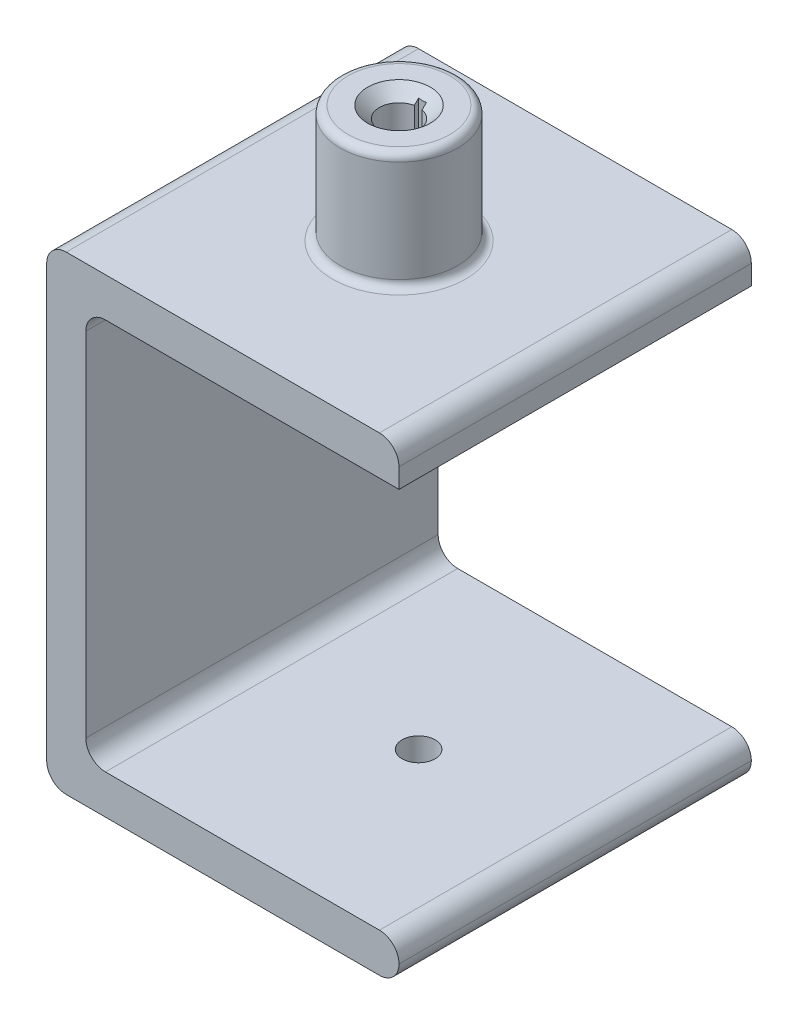
ISO-10303-21;
HEADER;
FILE_DESCRIPTION(('STEP AP214'),'2;1');
FILE_NAME('part.step','',(''),(''),'','','');
FILE_SCHEMA(('AUTOMOTIVE_DESIGN { 1 0 10303 214 1 1 1 1 }'));
ENDSEC;
DATA;
#1=APPLICATION_CONTEXT('core data for automotive mechanical design processes');
#2=APPLICATION_PROTOCOL_DEFINITION('international standard','automotive_design',2000,#1);
#3=PRODUCT_CONTEXT('',#1,'mechanical');
#4=PRODUCT('Part','Part','',(#3));
#5=PRODUCT_RELATED_PRODUCT_CATEGORY('part','',(#4));
#6=PRODUCT_DEFINITION_FORMATION('','',#4);
#7=PRODUCT_DEFINITION_CONTEXT('part definition',#1,'design');
#8=PRODUCT_DEFINITION('design','',#6,#7);
#9=PRODUCT_DEFINITION_SHAPE('','',#8);
#10=(LENGTH_UNIT() NAMED_UNIT(*) SI_UNIT(.MILLI.,.METRE.));
#11=(NAMED_UNIT(*) PLANE_ANGLE_UNIT() SI_UNIT($,.RADIAN.));
#12=(NAMED_UNIT(*) SI_UNIT($,.STERADIAN.) SOLID_ANGLE_UNIT());
#13=UNCERTAINTY_MEASURE_WITH_UNIT(LENGTH_MEASURE(1.E-05),#10,'distance_accuracy_value','');
#14=(GEOMETRIC_REPRESENTATION_CONTEXT(3) GLOBAL_UNCERTAINTY_ASSIGNED_CONTEXT((#13)) GLOBAL_UNIT_ASSIGNED_CONTEXT((#10,
#11,#12)) REPRESENTATION_CONTEXT('',''));
#15=CARTESIAN_POINT('',(0.,0.,0.));
#16=DIRECTION('',(0.,0.,1.));
#17=DIRECTION('',(1.,0.,0.));
#18=AXIS2_PLACEMENT_3D('',#15,#16,#17);
#19=CARTESIAN_POINT('',(0.,152.4,57.15));
#20=DIRECTION('',(0.,-1.,0.));
#21=DIRECTION('',(1.,0.,0.));
#22=AXIS2_PLACEMENT_3D('',#19,#20,#21);
#23=PLANE('',#22);
#24=CARTESIAN_POINT('',(57.15,152.4,0.));
#25=DIRECTION('',(0.,-1.,0.));
#26=DIRECTION('',(1.,0.,0.));
#27=AXIS2_PLACEMENT_3D('',#24,#25,#26);
#28=CIRCLE('',#27,21.59);
#29=CARTESIAN_POINT('',(78.74,152.4,0.));
#30=VERTEX_POINT('',#29);
#31=EDGE_CURVE('E323',#30,#30,#28,.T.);
#32=ORIENTED_EDGE('',*,*,#31,.T.);
#33=EDGE_LOOP('',(#32));
#34=FACE_BOUND('',#33,.T.);
#35=DIRECTION('',(-1.,0.,0.));
#36=VECTOR('',#35,1.);
#37=CARTESIAN_POINT('',(0.,152.4,57.15));
#38=LINE('',#37,#36);
#39=CARTESIAN_POINT('',(107.95,152.4,57.15));
#40=VERTEX_POINT('',#39);
#41=CARTESIAN_POINT('',(6.35,152.4,57.15));
#42=VERTEX_POINT('',#41);
#43=EDGE_CURVE('E230',#40,#42,#38,.T.);
#44=ORIENTED_EDGE('',*,*,#43,.F.);
#45=DIRECTION('',(0.,0.,-1.));
#46=VECTOR('',#45,1.);
#47=CARTESIAN_POINT('',(107.95,152.4,57.15));
#48=LINE('',#47,#46);
#49=CARTESIAN_POINT('',(107.95,152.4,-57.15));
#50=VERTEX_POINT('',#49);
#51=EDGE_CURVE('E312',#40,#50,#48,.T.);
#52=ORIENTED_EDGE('',*,*,#51,.T.);
#53=DIRECTION('',(-1.,0.,0.));
#54=VECTOR('',#53,1.);
#55=CARTESIAN_POINT('',(0.,152.4,-57.15));
#56=LINE('',#55,#54);
#57=CARTESIAN_POINT('',(6.35,152.4,-57.15));
#58=VERTEX_POINT('',#57);
#59=EDGE_CURVE('E249',#50,#58,#56,.T.);
#60=ORIENTED_EDGE('',*,*,#59,.T.);
#61=DIRECTION('',(0.,0.,-1.));
#62=VECTOR('',#61,1.);
#63=CARTESIAN_POINT('',(6.35,152.4,57.15));
#64=LINE('',#63,#62);
#65=EDGE_CURVE('E292',#58,#42,#64,.F.);
#66=ORIENTED_EDGE('',*,*,#65,.T.);
#67=EDGE_LOOP('',(#44,#52,#60,#66));
#68=FACE_BOUND('',#67,.T.);
#69=ADVANCED_FACE('F45',(#34,#68),#23,.F.);
#70=CARTESIAN_POINT('',(0.,0.,57.15));
#71=DIRECTION('',(0.,1.,0.));
#72=DIRECTION('',(0.,0.,1.));
#73=AXIS2_PLACEMENT_3D('',#70,#71,#72);
#74=PLANE('',#73);
#75=CARTESIAN_POINT('',(63.5,0.,0.));
#76=DIRECTION('',(0.,-1.,0.));
#77=DIRECTION('',(0.,0.,-1.));
#78=AXIS2_PLACEMENT_3D('',#75,#76,#77);
#79=CIRCLE('',#78,5.35813);
#80=CARTESIAN_POINT('',(63.5,0.,-5.35812999999999));
#81=VERTEX_POINT('',#80);
#82=EDGE_CURVE('E209',#81,#81,#79,.T.);
#83=ORIENTED_EDGE('',*,*,#82,.F.);
#84=EDGE_LOOP('',(#83));
#85=FACE_BOUND('',#84,.T.);
#86=DIRECTION('',(1.,0.,0.));
#87=VECTOR('',#86,1.);
#88=CARTESIAN_POINT('',(0.,0.,-57.15));
#89=LINE('',#88,#87);
#90=CARTESIAN_POINT('',(6.35,0.,-57.15));
#91=VERTEX_POINT('',#90);
#92=CARTESIAN_POINT('',(107.95,0.,-57.15));
#93=VERTEX_POINT('',#92);
#94=EDGE_CURVE('E236',#91,#93,#89,.T.);
#95=ORIENTED_EDGE('',*,*,#94,.T.);
#96=DIRECTION('',(0.,0.,-1.));
#97=VECTOR('',#96,1.);
#98=CARTESIAN_POINT('',(107.95,0.,57.15));
#99=LINE('',#98,#97);
#100=CARTESIAN_POINT('',(107.95,0.,57.15));
#101=VERTEX_POINT('',#100);
#102=EDGE_CURVE('E301',#93,#101,#99,.F.);
#103=ORIENTED_EDGE('',*,*,#102,.T.);
#104=DIRECTION('',(1.,0.,0.));
#105=VECTOR('',#104,1.);
#106=CARTESIAN_POINT('',(0.,0.,57.15));
#107=LINE('',#106,#105);
#108=CARTESIAN_POINT('',(6.35,0.,57.15));
#109=VERTEX_POINT('',#108);
#110=EDGE_CURVE('E216',#109,#101,#107,.T.);
#111=ORIENTED_EDGE('',*,*,#110,.F.);
#112=DIRECTION('',(0.,0.,-1.));
#113=VECTOR('',#112,1.);
#114=CARTESIAN_POINT('',(6.35,0.,57.15));
#115=LINE('',#114,#113);
#116=EDGE_CURVE('E275',#109,#91,#115,.T.);
#117=ORIENTED_EDGE('',*,*,#116,.T.);
#118=EDGE_LOOP('',(#95,#103,#111,#117));
#119=FACE_BOUND('',#118,.T.);
#120=ADVANCED_FACE('F399',(#85,#119),#74,.F.);
#121=CARTESIAN_POINT('',(12.7,12.7,57.15));
#122=DIRECTION('',(0.,-1.,0.));
#123=DIRECTION('',(0.,0.,-1.));
#124=AXIS2_PLACEMENT_3D('',#121,#122,#123);
#125=PLANE('',#124);
#126=CARTESIAN_POINT('',(63.5,12.7,0.));
#127=DIRECTION('',(0.,-1.,0.));
#128=DIRECTION('',(0.,0.,-1.));
#129=AXIS2_PLACEMENT_3D('',#126,#127,#128);
#130=CIRCLE('',#129,5.35813);
#131=CARTESIAN_POINT('',(63.5,12.7,-5.35812999999999));
#132=VERTEX_POINT('',#131);
#133=EDGE_CURVE('E212',#132,#132,#130,.T.);
#134=ORIENTED_EDGE('',*,*,#133,.T.);
#135=EDGE_LOOP('',(#134));
#136=FACE_BOUND('',#135,.T.);
#137=DIRECTION('',(-1.,0.,0.));
#138=VECTOR('',#137,1.);
#139=CARTESIAN_POINT('',(12.7,12.7,57.15));
#140=LINE('',#139,#138);
#141=CARTESIAN_POINT('',(107.95,12.7,57.15));
#142=VERTEX_POINT('',#141);
#143=CARTESIAN_POINT('',(19.05,12.7,57.15));
#144=VERTEX_POINT('',#143);
#145=EDGE_CURVE('E219',#142,#144,#140,.T.);
#146=ORIENTED_EDGE('',*,*,#145,.F.);
#147=DIRECTION('',(0.,0.,-1.));
#148=VECTOR('',#147,1.);
#149=CARTESIAN_POINT('',(107.95,12.7,57.15));
#150=LINE('',#149,#148);
#151=CARTESIAN_POINT('',(107.95,12.7,-57.15));
#152=VERTEX_POINT('',#151);
#153=EDGE_CURVE('E310',#142,#152,#150,.T.);
#154=ORIENTED_EDGE('',*,*,#153,.T.);
#155=DIRECTION('',(-1.,0.,0.));
#156=VECTOR('',#155,1.);
#157=CARTESIAN_POINT('',(12.7,12.7,-57.15));
#158=LINE('',#157,#156);
#159=CARTESIAN_POINT('',(19.05,12.7,-57.15));
#160=VERTEX_POINT('',#159);
#161=EDGE_CURVE('E239',#152,#160,#158,.T.);
#162=ORIENTED_EDGE('',*,*,#161,.T.);
#163=DIRECTION('',(0.,0.,-1.));
#164=VECTOR('',#163,1.);
#165=CARTESIAN_POINT('',(19.05,12.7,57.15));
#166=LINE('',#165,#164);
#167=EDGE_CURVE('E260',#160,#144,#166,.F.);
#168=ORIENTED_EDGE('',*,*,#167,.T.);
#169=EDGE_LOOP('',(#146,#154,#162,#168));
#170=FACE_BOUND('',#169,.T.);
#171=ADVANCED_FACE('F395',(#136,#170),#125,.F.);
#172=CARTESIAN_POINT('',(12.7,139.7,57.15));
#173=DIRECTION('',(-1.,0.,0.));
#174=DIRECTION('',(0.,0.,1.));
#175=AXIS2_PLACEMENT_3D('',#172,#173,#174);
#176=PLANE('',#175);
#177=DIRECTION('',(0.,1.,0.));
#178=VECTOR('',#177,1.);
#179=CARTESIAN_POINT('',(12.7,139.7,57.15));
#180=LINE('',#179,#178);
#181=CARTESIAN_POINT('',(12.7,19.05,57.15));
#182=VERTEX_POINT('',#181);
#183=CARTESIAN_POINT('',(12.7,133.35,57.15));
#184=VERTEX_POINT('',#183);
#185=EDGE_CURVE('E222',#182,#184,#180,.T.);
#186=ORIENTED_EDGE('',*,*,#185,.F.);
#187=DIRECTION('',(0.,0.,-1.));
#188=VECTOR('',#187,1.);
#189=CARTESIAN_POINT('',(12.7,19.05,-57.15));
#190=LINE('',#189,#188);
#191=CARTESIAN_POINT('',(12.7,19.05,-57.15));
#192=VERTEX_POINT('',#191);
#193=EDGE_CURVE('E257',#182,#192,#190,.T.);
#194=ORIENTED_EDGE('',*,*,#193,.T.);
#195=DIRECTION('',(0.,1.,0.));
#196=VECTOR('',#195,1.);
#197=CARTESIAN_POINT('',(12.7,139.7,-57.15));
#198=LINE('',#197,#196);
#199=CARTESIAN_POINT('',(12.7,133.35,-57.15));
#200=VERTEX_POINT('',#199);
#201=EDGE_CURVE('E241',#192,#200,#198,.T.);
#202=ORIENTED_EDGE('',*,*,#201,.T.);
#203=DIRECTION('',(0.,0.,-1.));
#204=VECTOR('',#203,1.);
#205=CARTESIAN_POINT('',(12.7,133.35,57.15));
#206=LINE('',#205,#204);
#207=EDGE_CURVE('E255',#200,#184,#206,.F.);
#208=ORIENTED_EDGE('',*,*,#207,.T.);
#209=EDGE_LOOP('',(#186,#194,#202,#208));
#210=FACE_BOUND('',#209,.T.);
#211=ADVANCED_FACE('F391',(#210),#176,.F.);
#212=CARTESIAN_POINT('',(114.3,139.7,57.15));
#213=DIRECTION('',(0.,1.,0.));
#214=DIRECTION('',(-1.,0.,0.));
#215=AXIS2_PLACEMENT_3D('',#212,#213,#214);
#216=PLANE('',#215);
#217=DIRECTION('',(1.,0.,0.));
#218=VECTOR('',#217,1.);
#219=CARTESIAN_POINT('',(114.3,139.7,57.15));
#220=LINE('',#219,#218);
#221=CARTESIAN_POINT('',(19.05,139.7,57.15));
#222=VERTEX_POINT('',#221);
#223=CARTESIAN_POINT('',(114.3,139.7,57.15));
#224=VERTEX_POINT('',#223);
#225=EDGE_CURVE('E225',#222,#224,#220,.T.);
#226=ORIENTED_EDGE('',*,*,#225,.F.);
#227=DIRECTION('',(0.,0.,-1.));
#228=VECTOR('',#227,1.);
#229=CARTESIAN_POINT('',(19.05,139.7,-57.15));
#230=LINE('',#229,#228);
#231=CARTESIAN_POINT('',(19.05,139.7,-57.15));
#232=VERTEX_POINT('',#231);
#233=EDGE_CURVE('E263',#222,#232,#230,.T.);
#234=ORIENTED_EDGE('',*,*,#233,.T.);
#235=DIRECTION('',(1.,0.,0.));
#236=VECTOR('',#235,1.);
#237=CARTESIAN_POINT('',(114.3,139.7,-57.15));
#238=LINE('',#237,#236);
#239=CARTESIAN_POINT('',(114.3,139.7,-57.15));
#240=VERTEX_POINT('',#239);
#241=EDGE_CURVE('E244',#232,#240,#238,.T.);
#242=ORIENTED_EDGE('',*,*,#241,.T.);
#243=DIRECTION('',(0.,0.,-1.));
#244=VECTOR('',#243,1.);
#245=CARTESIAN_POINT('',(114.3,139.7,57.15));
#246=LINE('',#245,#244);
#247=EDGE_CURVE('E235',#224,#240,#246,.T.);
#248=ORIENTED_EDGE('',*,*,#247,.F.);
#249=EDGE_LOOP('',(#226,#234,#242,#248));
#250=FACE_BOUND('',#249,.T.);
#251=ADVANCED_FACE('F387',(#250),#216,.F.);
#252=CARTESIAN_POINT('',(114.3,152.4,57.15));
#253=DIRECTION('',(-1.,0.,0.));
#254=DIRECTION('',(0.,-1.,0.));
#255=AXIS2_PLACEMENT_3D('',#252,#253,#254);
#256=PLANE('',#255);
#257=DIRECTION('',(0.,1.,0.));
#258=VECTOR('',#257,1.);
#259=CARTESIAN_POINT('',(114.3,152.4,-57.15));
#260=LINE('',#259,#258);
#261=CARTESIAN_POINT('',(114.3,146.05,-57.15));
#262=VERTEX_POINT('',#261);
#263=EDGE_CURVE('E246',#240,#262,#260,.T.);
#264=ORIENTED_EDGE('',*,*,#263,.T.);
#265=DIRECTION('',(0.,0.,-1.));
#266=VECTOR('',#265,1.);
#267=CARTESIAN_POINT('',(114.3,146.05,57.15));
#268=LINE('',#267,#266);
#269=CARTESIAN_POINT('',(114.3,146.05,57.15));
#270=VERTEX_POINT('',#269);
#271=EDGE_CURVE('E195',#262,#270,#268,.F.);
#272=ORIENTED_EDGE('',*,*,#271,.T.);
#273=DIRECTION('',(0.,1.,0.));
#274=VECTOR('',#273,1.);
#275=CARTESIAN_POINT('',(114.3,152.4,57.15));
#276=LINE('',#275,#274);
#277=EDGE_CURVE('E227',#224,#270,#276,.T.);
#278=ORIENTED_EDGE('',*,*,#277,.F.);
#279=ORIENTED_EDGE('',*,*,#247,.T.);
#280=EDGE_LOOP('',(#264,#272,#278,#279));
#281=FACE_BOUND('',#280,.T.);
#282=ADVANCED_FACE('F378',(#281),#256,.F.);
#283=CARTESIAN_POINT('',(0.,0.,57.15));
#284=DIRECTION('',(1.,0.,0.));
#285=DIRECTION('',(0.,0.,-1.));
#286=AXIS2_PLACEMENT_3D('',#283,#284,#285);
#287=PLANE('',#286);
#288=DIRECTION('',(0.,-1.,0.));
#289=VECTOR('',#288,1.);
#290=CARTESIAN_POINT('',(0.,0.,-57.15));
#291=LINE('',#290,#289);
#292=CARTESIAN_POINT('',(0.,146.05,-57.15));
#293=VERTEX_POINT('',#292);
#294=CARTESIAN_POINT('',(0.,6.35,-57.15));
#295=VERTEX_POINT('',#294);
#296=EDGE_CURVE('E220',#293,#295,#291,.T.);
#297=ORIENTED_EDGE('',*,*,#296,.T.);
#298=DIRECTION('',(0.,0.,-1.));
#299=VECTOR('',#298,1.);
#300=CARTESIAN_POINT('',(0.,6.35,57.15));
#301=LINE('',#300,#299);
#302=CARTESIAN_POINT('',(0.,6.35,57.15));
#303=VERTEX_POINT('',#302);
#304=EDGE_CURVE('E286',#295,#303,#301,.F.);
#305=ORIENTED_EDGE('',*,*,#304,.T.);
#306=DIRECTION('',(0.,-1.,0.));
#307=VECTOR('',#306,1.);
#308=CARTESIAN_POINT('',(0.,0.,57.15));
#309=LINE('',#308,#307);
#310=CARTESIAN_POINT('',(0.,146.05,57.15));
#311=VERTEX_POINT('',#310);
#312=EDGE_CURVE('E232',#311,#303,#309,.T.);
#313=ORIENTED_EDGE('',*,*,#312,.F.);
#314=DIRECTION('',(0.,0.,-1.));
#315=VECTOR('',#314,1.);
#316=CARTESIAN_POINT('',(0.,146.05,57.15));
#317=LINE('',#316,#315);
#318=EDGE_CURVE('E283',#311,#293,#317,.T.);
#319=ORIENTED_EDGE('',*,*,#318,.T.);
#320=EDGE_LOOP('',(#297,#305,#313,#319));
#321=FACE_BOUND('',#320,.T.);
#322=ADVANCED_FACE('F370',(#321),#287,.F.);
#323=CARTESIAN_POINT('',(0.,0.,57.15));
#324=DIRECTION('',(0.,0.,-1.));
#325=DIRECTION('',(-1.,0.,0.));
#326=AXIS2_PLACEMENT_3D('',#323,#324,#325);
#327=PLANE('',#326);
#328=ORIENTED_EDGE('',*,*,#110,.T.);
#329=CARTESIAN_POINT('',(107.95,6.35,57.15));
#330=DIRECTION('',(0.,0.,-1.));
#331=DIRECTION('',(-1.,0.,0.));
#332=AXIS2_PLACEMENT_3D('',#329,#330,#331);
#333=CIRCLE('',#332,6.35);
#334=CARTESIAN_POINT('',(114.3,6.35000000000001,57.15));
#335=VERTEX_POINT('',#334);
#336=EDGE_CURVE('E308',#101,#335,#333,.F.);
#337=ORIENTED_EDGE('',*,*,#336,.T.);
#338=CARTESIAN_POINT('',(107.95,6.35000000000001,57.15));
#339=DIRECTION('',(0.,0.,-1.));
#340=DIRECTION('',(-1.,0.,0.));
#341=AXIS2_PLACEMENT_3D('',#338,#339,#340);
#342=CIRCLE('',#341,6.35);
#343=EDGE_CURVE('E306',#335,#142,#342,.F.);
#344=ORIENTED_EDGE('',*,*,#343,.T.);
#345=ORIENTED_EDGE('',*,*,#145,.T.);
#346=CARTESIAN_POINT('',(19.05,19.05,57.15));
#347=DIRECTION('',(0.,0.,-1.));
#348=DIRECTION('',(-1.,0.,0.));
#349=AXIS2_PLACEMENT_3D('',#346,#347,#348);
#350=CIRCLE('',#349,6.35);
#351=EDGE_CURVE('E269',#144,#182,#350,.T.);
#352=ORIENTED_EDGE('',*,*,#351,.T.);
#353=ORIENTED_EDGE('',*,*,#185,.T.);
#354=CARTESIAN_POINT('',(19.05,133.35,57.15));
#355=DIRECTION('',(0.,0.,-1.));
#356=DIRECTION('',(-1.,0.,0.));
#357=AXIS2_PLACEMENT_3D('',#354,#355,#356);
#358=CIRCLE('',#357,6.35);
#359=EDGE_CURVE('E273',#184,#222,#358,.T.);
#360=ORIENTED_EDGE('',*,*,#359,.T.);
#361=ORIENTED_EDGE('',*,*,#225,.T.);
#362=ORIENTED_EDGE('',*,*,#277,.T.);
#363=CARTESIAN_POINT('',(107.95,146.05,57.15));
#364=DIRECTION('',(0.,0.,-1.));
#365=DIRECTION('',(-1.,0.,0.));
#366=AXIS2_PLACEMENT_3D('',#363,#364,#365);
#367=CIRCLE('',#366,6.35);
#368=EDGE_CURVE('E304',#270,#40,#367,.F.);
#369=ORIENTED_EDGE('',*,*,#368,.T.);
#370=ORIENTED_EDGE('',*,*,#43,.T.);
#371=CARTESIAN_POINT('',(6.35,146.05,57.15));
#372=DIRECTION('',(0.,0.,-1.));
#373=DIRECTION('',(-1.,0.,0.));
#374=AXIS2_PLACEMENT_3D('',#371,#372,#373);
#375=CIRCLE('',#374,6.35);
#376=EDGE_CURVE('E288',#42,#311,#375,.F.);
#377=ORIENTED_EDGE('',*,*,#376,.T.);
#378=ORIENTED_EDGE('',*,*,#312,.T.);
#379=CARTESIAN_POINT('',(6.35,6.35,57.15));
#380=DIRECTION('',(0.,0.,-1.));
#381=DIRECTION('',(-1.,0.,0.));
#382=AXIS2_PLACEMENT_3D('',#379,#380,#381);
#383=CIRCLE('',#382,6.35);
#384=EDGE_CURVE('E290',#303,#109,#383,.F.);
#385=ORIENTED_EDGE('',*,*,#384,.T.);
#386=EDGE_LOOP('',(#328,#337,#344,#345,#352,#353,#360,#361,#362,#369,#370,#377,#378,#385));
#387=FACE_BOUND('',#386,.T.);
#388=ADVANCED_FACE('F366',(#387),#327,.F.);
#389=CARTESIAN_POINT('',(0.,0.,-57.15));
#390=DIRECTION('',(0.,0.,-1.));
#391=DIRECTION('',(-1.,0.,0.));
#392=AXIS2_PLACEMENT_3D('',#389,#390,#391);
#393=PLANE('',#392);
#394=CARTESIAN_POINT('',(107.95,6.35000000000001,-57.15));
#395=DIRECTION('',(0.,0.,-1.));
#396=DIRECTION('',(-1.,0.,0.));
#397=AXIS2_PLACEMENT_3D('',#394,#395,#396);
#398=CIRCLE('',#397,6.35);
#399=CARTESIAN_POINT('',(114.3,6.35000000000001,-57.15));
#400=VERTEX_POINT('',#399);
#401=EDGE_CURVE('E297',#152,#400,#398,.T.);
#402=ORIENTED_EDGE('',*,*,#401,.T.);
#403=CARTESIAN_POINT('',(107.95,6.35,-57.15));
#404=DIRECTION('',(0.,0.,-1.));
#405=DIRECTION('',(-1.,0.,0.));
#406=AXIS2_PLACEMENT_3D('',#403,#404,#405);
#407=CIRCLE('',#406,6.35);
#408=EDGE_CURVE('E299',#400,#93,#407,.T.);
#409=ORIENTED_EDGE('',*,*,#408,.T.);
#410=ORIENTED_EDGE('',*,*,#94,.F.);
#411=CARTESIAN_POINT('',(6.35,6.35,-57.15));
#412=DIRECTION('',(0.,0.,-1.));
#413=DIRECTION('',(-1.,0.,0.));
#414=AXIS2_PLACEMENT_3D('',#411,#412,#413);
#415=CIRCLE('',#414,6.35);
#416=EDGE_CURVE('E281',#91,#295,#415,.T.);
#417=ORIENTED_EDGE('',*,*,#416,.T.);
#418=ORIENTED_EDGE('',*,*,#296,.F.);
#419=CARTESIAN_POINT('',(6.35,146.05,-57.15));
#420=DIRECTION('',(0.,0.,-1.));
#421=DIRECTION('',(-1.,0.,0.));
#422=AXIS2_PLACEMENT_3D('',#419,#420,#421);
#423=CIRCLE('',#422,6.35);
#424=EDGE_CURVE('E278',#293,#58,#423,.T.);
#425=ORIENTED_EDGE('',*,*,#424,.T.);
#426=ORIENTED_EDGE('',*,*,#59,.F.);
#427=CARTESIAN_POINT('',(107.95,146.05,-57.15));
#428=DIRECTION('',(0.,0.,-1.));
#429=DIRECTION('',(-1.,0.,0.));
#430=AXIS2_PLACEMENT_3D('',#427,#428,#429);
#431=CIRCLE('',#430,6.35);
#432=EDGE_CURVE('E295',#50,#262,#431,.T.);
#433=ORIENTED_EDGE('',*,*,#432,.T.);
#434=ORIENTED_EDGE('',*,*,#263,.F.);
#435=ORIENTED_EDGE('',*,*,#241,.F.);
#436=CARTESIAN_POINT('',(19.05,133.35,-57.15));
#437=DIRECTION('',(0.,0.,-1.));
#438=DIRECTION('',(-1.,0.,0.));
#439=AXIS2_PLACEMENT_3D('',#436,#437,#438);
#440=CIRCLE('',#439,6.35);
#441=EDGE_CURVE('E271',#232,#200,#440,.F.);
#442=ORIENTED_EDGE('',*,*,#441,.T.);
#443=ORIENTED_EDGE('',*,*,#201,.F.);
#444=CARTESIAN_POINT('',(19.05,19.05,-57.15));
#445=DIRECTION('',(0.,0.,-1.));
#446=DIRECTION('',(-1.,0.,0.));
#447=AXIS2_PLACEMENT_3D('',#444,#445,#446);
#448=CIRCLE('',#447,6.35);
#449=EDGE_CURVE('E266',#192,#160,#448,.F.);
#450=ORIENTED_EDGE('',*,*,#449,.T.);
#451=ORIENTED_EDGE('',*,*,#161,.F.);
#452=EDGE_LOOP('',(#402,#409,#410,#417,#418,#425,#426,#433,#434,#435,#442,#443,#450,#451));
#453=FACE_BOUND('',#452,.T.);
#454=ADVANCED_FACE('F369',(#453),#393,.T.);
#455=CARTESIAN_POINT('',(19.05,19.05,57.15));
#456=DIRECTION('',(0.,0.,1.));
#457=DIRECTION('',(1.,0.,0.));
#458=AXIS2_PLACEMENT_3D('',#455,#456,#457);
#459=CYLINDRICAL_SURFACE('',#458,6.35);
#460=ORIENTED_EDGE('',*,*,#351,.F.);
#461=ORIENTED_EDGE('',*,*,#167,.F.);
#462=ORIENTED_EDGE('',*,*,#449,.F.);
#463=ORIENTED_EDGE('',*,*,#193,.F.);
#464=EDGE_LOOP('',(#460,#461,#462,#463));
#465=FACE_BOUND('',#464,.T.);
#466=ADVANCED_FACE('F374',(#465),#459,.F.);
#467=CARTESIAN_POINT('',(19.05,133.35,57.15));
#468=DIRECTION('',(0.,0.,1.));
#469=DIRECTION('',(1.,0.,0.));
#470=AXIS2_PLACEMENT_3D('',#467,#468,#469);
#471=CYLINDRICAL_SURFACE('',#470,6.35);
#472=ORIENTED_EDGE('',*,*,#359,.F.);
#473=ORIENTED_EDGE('',*,*,#207,.F.);
#474=ORIENTED_EDGE('',*,*,#441,.F.);
#475=ORIENTED_EDGE('',*,*,#233,.F.);
#476=EDGE_LOOP('',(#472,#473,#474,#475));
#477=FACE_BOUND('',#476,.T.);
#478=ADVANCED_FACE('F406',(#477),#471,.F.);
#479=CARTESIAN_POINT('',(6.35,6.35,57.15));
#480=DIRECTION('',(0.,0.,-1.));
#481=DIRECTION('',(-1.,0.,0.));
#482=AXIS2_PLACEMENT_3D('',#479,#480,#481);
#483=CYLINDRICAL_SURFACE('',#482,6.35);
#484=ORIENTED_EDGE('',*,*,#384,.F.);
#485=ORIENTED_EDGE('',*,*,#304,.F.);
#486=ORIENTED_EDGE('',*,*,#416,.F.);
#487=ORIENTED_EDGE('',*,*,#116,.F.);
#488=EDGE_LOOP('',(#484,#485,#486,#487));
#489=FACE_BOUND('',#488,.T.);
#490=ADVANCED_FACE('F410',(#489),#483,.T.);
#491=CARTESIAN_POINT('',(6.35,146.05,57.15));
#492=DIRECTION('',(0.,0.,-1.));
#493=DIRECTION('',(-1.,0.,0.));
#494=AXIS2_PLACEMENT_3D('',#491,#492,#493);
#495=CYLINDRICAL_SURFACE('',#494,6.35);
#496=ORIENTED_EDGE('',*,*,#376,.F.);
#497=ORIENTED_EDGE('',*,*,#65,.F.);
#498=ORIENTED_EDGE('',*,*,#424,.F.);
#499=ORIENTED_EDGE('',*,*,#318,.F.);
#500=EDGE_LOOP('',(#496,#497,#498,#499));
#501=FACE_BOUND('',#500,.T.);
#502=ADVANCED_FACE('F414',(#501),#495,.T.);
#503=CARTESIAN_POINT('',(107.95,6.35000000000001,57.15));
#504=DIRECTION('',(0.,0.,-1.));
#505=DIRECTION('',(-1.,0.,0.));
#506=AXIS2_PLACEMENT_3D('',#503,#504,#505);
#507=CYLINDRICAL_SURFACE('',#506,6.35);
#508=ORIENTED_EDGE('',*,*,#153,.F.);
#509=ORIENTED_EDGE('',*,*,#343,.F.);
#510=DIRECTION('',(0.,0.,-1.));
#511=VECTOR('',#510,1.);
#512=CARTESIAN_POINT('',(114.3,6.35000000000001,57.15));
#513=LINE('',#512,#511);
#514=EDGE_CURVE('E215',#400,#335,#513,.F.);
#515=ORIENTED_EDGE('',*,*,#514,.F.);
#516=ORIENTED_EDGE('',*,*,#401,.F.);
#517=EDGE_LOOP('',(#508,#509,#515,#516));
#518=FACE_BOUND('',#517,.T.);
#519=ADVANCED_FACE('F418',(#518),#507,.T.);
#520=CARTESIAN_POINT('',(107.95,6.35,57.15));
#521=DIRECTION('',(0.,0.,-1.));
#522=DIRECTION('',(-1.,0.,0.));
#523=AXIS2_PLACEMENT_3D('',#520,#521,#522);
#524=CYLINDRICAL_SURFACE('',#523,6.35);
#525=ORIENTED_EDGE('',*,*,#336,.F.);
#526=ORIENTED_EDGE('',*,*,#102,.F.);
#527=ORIENTED_EDGE('',*,*,#408,.F.);
#528=ORIENTED_EDGE('',*,*,#514,.T.);
#529=EDGE_LOOP('',(#525,#526,#527,#528));
#530=FACE_BOUND('',#529,.T.);
#531=ADVANCED_FACE('F420',(#530),#524,.T.);
#532=CARTESIAN_POINT('',(107.95,146.05,57.15));
#533=DIRECTION('',(0.,0.,-1.));
#534=DIRECTION('',(-1.,0.,0.));
#535=AXIS2_PLACEMENT_3D('',#532,#533,#534);
#536=CYLINDRICAL_SURFACE('',#535,6.35);
#537=ORIENTED_EDGE('',*,*,#368,.F.);
#538=ORIENTED_EDGE('',*,*,#271,.F.);
#539=ORIENTED_EDGE('',*,*,#432,.F.);
#540=ORIENTED_EDGE('',*,*,#51,.F.);
#541=EDGE_LOOP('',(#537,#538,#539,#540));
#542=FACE_BOUND('',#541,.T.);
#543=ADVANCED_FACE('F364',(#542),#536,.T.);
#544=CARTESIAN_POINT('',(63.5,0.,0.));
#545=DIRECTION('',(0.,-1.,0.));
#546=DIRECTION('',(0.,0.,-1.));
#547=AXIS2_PLACEMENT_3D('',#544,#545,#546);
#548=CYLINDRICAL_SURFACE('',#547,5.35813);
#549=ORIENTED_EDGE('',*,*,#133,.F.);
#550=EDGE_LOOP('',(#549));
#551=FACE_BOUND('',#550,.T.);
#552=ORIENTED_EDGE('',*,*,#82,.T.);
#553=EDGE_LOOP('',(#552));
#554=FACE_BOUND('',#553,.T.);
#555=ADVANCED_FACE('F357',(#551,#554),#548,.F.);
#556=CARTESIAN_POINT('',(57.15,190.5,0.));
#557=DIRECTION('',(0.,1.,0.));
#558=DIRECTION('',(-1.,0.,0.));
#559=AXIS2_PLACEMENT_3D('',#556,#557,#558);
#560=PLANE('',#559);
#561=CARTESIAN_POINT('',(57.15,190.5,0.));
#562=DIRECTION('',(0.,1.,0.));
#563=DIRECTION('',(-1.,0.,0.));
#564=AXIS2_PLACEMENT_3D('',#561,#562,#563);
#565=CIRCLE('',#564,10.1600000000002);
#566=CARTESIAN_POINT('',(55.1179999999999,190.5,-9.954726314671));
#567=VERTEX_POINT('',#566);
#568=EDGE_CURVE('E11',#567,#567,#565,.F.);
#569=ORIENTED_EDGE('',*,*,#568,.T.);
#570=EDGE_LOOP('',(#569));
#571=FACE_BOUND('',#570,.T.);
#572=CARTESIAN_POINT('',(57.15,190.5,0.));
#573=DIRECTION('',(0.,1.,0.));
#574=DIRECTION('',(-1.,0.,0.));
#575=AXIS2_PLACEMENT_3D('',#572,#573,#574);
#576=CIRCLE('',#575,16.51);
#577=CARTESIAN_POINT('',(40.6399999999999,190.5,0.));
#578=VERTEX_POINT('',#577);
#579=EDGE_CURVE('E326',#578,#578,#576,.T.);
#580=ORIENTED_EDGE('',*,*,#579,.T.);
#581=EDGE_LOOP('',(#580));
#582=FACE_BOUND('',#581,.T.);
#583=ADVANCED_FACE('F354',(#571,#582),#560,.T.);
#584=CARTESIAN_POINT('',(57.15,190.5,0.));
#585=DIRECTION('',(0.,-1.,0.));
#586=DIRECTION('',(1.,0.,0.));
#587=AXIS2_PLACEMENT_3D('',#584,#585,#586);
#588=CYLINDRICAL_SURFACE('',#587,19.05);
#589=CARTESIAN_POINT('',(57.15,154.94,0.));
#590=DIRECTION('',(0.,-1.,0.));
#591=DIRECTION('',(1.,0.,0.));
#592=AXIS2_PLACEMENT_3D('',#589,#590,#591);
#593=CIRCLE('',#592,19.05);
#594=CARTESIAN_POINT('',(76.2,154.94,0.));
#595=VERTEX_POINT('',#594);
#596=EDGE_CURVE('E320',#595,#595,#593,.F.);
#597=CARTESIAN_POINT('',(57.15,187.96,0.));
#598=DIRECTION('',(0.,1.,0.));
#599=DIRECTION('',(-1.,0.,0.));
#600=AXIS2_PLACEMENT_3D('',#597,#598,#599);
#601=CIRCLE('',#600,19.05);
#602=CARTESIAN_POINT('',(76.2,187.96,0.));
#603=VERTEX_POINT('',#602);
#604=EDGE_CURVE('E194',#603,#603,#601,.F.);
#605=CARTESIAN_POINT('',(76.2,154.94,0.));
#606=CARTESIAN_POINT('',(76.2,155.283958333333,0.));
#607=CARTESIAN_POINT('',(76.2,155.627916666667,0.));
#608=CARTESIAN_POINT('',(76.2,156.315833333333,0.));
#609=CARTESIAN_POINT('',(76.2,156.659791666667,0.));
#610=CARTESIAN_POINT('',(76.2,157.347708333333,0.));
#611=CARTESIAN_POINT('',(76.2,157.691666666667,0.));
#612=CARTESIAN_POINT('',(76.2,158.379583333333,0.));
#613=CARTESIAN_POINT('',(76.2,158.723541666667,0.));
#614=CARTESIAN_POINT('',(76.2,159.411458333333,0.));
#615=CARTESIAN_POINT('',(76.2,159.755416666667,0.));
#616=CARTESIAN_POINT('',(76.2,160.443333333333,0.));
#617=CARTESIAN_POINT('',(76.2,160.787291666667,0.));
#618=CARTESIAN_POINT('',(76.2,161.475208333333,0.));
#619=CARTESIAN_POINT('',(76.2,161.819166666667,0.));
#620=CARTESIAN_POINT('',(76.2,162.507083333333,0.));
#621=CARTESIAN_POINT('',(76.2,162.851041666667,0.));
#622=CARTESIAN_POINT('',(76.2,163.538958333333,0.));
#623=CARTESIAN_POINT('',(76.2,163.882916666667,0.));
#624=CARTESIAN_POINT('',(76.2,164.570833333333,0.));
#625=CARTESIAN_POINT('',(76.2,164.914791666667,0.));
#626=CARTESIAN_POINT('',(76.2,165.602708333333,0.));
#627=CARTESIAN_POINT('',(76.2,165.946666666667,0.));
#628=CARTESIAN_POINT('',(76.2,166.634583333333,0.));
#629=CARTESIAN_POINT('',(76.2,166.978541666667,0.));
#630=CARTESIAN_POINT('',(76.2,167.666458333333,0.));
#631=CARTESIAN_POINT('',(76.2,168.010416666667,0.));
#632=CARTESIAN_POINT('',(76.2,168.698333333333,0.));
#633=CARTESIAN_POINT('',(76.2,169.042291666667,0.));
#634=CARTESIAN_POINT('',(76.2,169.730208333333,0.));
#635=CARTESIAN_POINT('',(76.2,170.074166666667,0.));
#636=CARTESIAN_POINT('',(76.2,170.762083333333,0.));
#637=CARTESIAN_POINT('',(76.2,171.106041666667,0.));
#638=CARTESIAN_POINT('',(76.2,171.793958333333,0.));
#639=CARTESIAN_POINT('',(76.2,172.137916666667,0.));
#640=CARTESIAN_POINT('',(76.2,172.825833333333,0.));
#641=CARTESIAN_POINT('',(76.2,173.169791666667,0.));
#642=CARTESIAN_POINT('',(76.2,173.857708333333,0.));
#643=CARTESIAN_POINT('',(76.2,174.201666666667,0.));
#644=CARTESIAN_POINT('',(76.2,174.889583333333,0.));
#645=CARTESIAN_POINT('',(76.2,175.233541666667,0.));
#646=CARTESIAN_POINT('',(76.2,175.921458333333,0.));
#647=CARTESIAN_POINT('',(76.2,176.265416666667,0.));
#648=CARTESIAN_POINT('',(76.2,176.953333333333,0.));
#649=CARTESIAN_POINT('',(76.2,177.297291666667,0.));
#650=CARTESIAN_POINT('',(76.2,177.985208333333,0.));
#651=CARTESIAN_POINT('',(76.2,178.329166666667,0.));
#652=CARTESIAN_POINT('',(76.2,179.017083333333,0.));
#653=CARTESIAN_POINT('',(76.2,179.361041666667,0.));
#654=CARTESIAN_POINT('',(76.2,180.048958333333,0.));
#655=CARTESIAN_POINT('',(76.2,180.392916666667,0.));
#656=CARTESIAN_POINT('',(76.2,181.080833333333,0.));
#657=CARTESIAN_POINT('',(76.2,181.424791666667,0.));
#658=CARTESIAN_POINT('',(76.2,182.112708333333,0.));
#659=CARTESIAN_POINT('',(76.2,182.456666666667,0.));
#660=CARTESIAN_POINT('',(76.2,183.144583333333,0.));
#661=CARTESIAN_POINT('',(76.2,183.488541666667,0.));
#662=CARTESIAN_POINT('',(76.2,184.176458333333,0.));
#663=CARTESIAN_POINT('',(76.2,184.520416666667,0.));
#664=CARTESIAN_POINT('',(76.2,185.208333333333,0.));
#665=CARTESIAN_POINT('',(76.2,185.552291666667,0.));
#666=CARTESIAN_POINT('',(76.2,186.240208333333,0.));
#667=CARTESIAN_POINT('',(76.2,186.584166666667,0.));
#668=CARTESIAN_POINT('',(76.2,187.272083333333,0.));
#669=CARTESIAN_POINT('',(76.2,187.616041666667,0.));
#670=CARTESIAN_POINT('',(76.2,187.96,0.));
#671=B_SPLINE_CURVE_WITH_KNOTS('',3,(#605,#606,#607,#608,#609,#610,#611,#612,#613,#614,#615,
#616,#617,#618,#619,#620,#621,#622,#623,#624,#625,#626,#627,#628,#629,#630,#631,#632,#633,#634,
#635,#636,#637,#638,#639,#640,#641,#642,#643,#644,#645,#646,#647,#648,#649,#650,#651,#652,#653,
#654,#655,#656,#657,#658,#659,#660,#661,#662,#663,#664,#665,#666,#667,#668,#669,#670),
.UNSPECIFIED.,.F.,.F.,(4,2,2,2,2,2,2,2,2,2,2,2,2,2,2,2,2,2,2,2,2,2,2,2,2,2,2,2,2,2,2,2,4),(0.,
1.03187500000002,2.06375,3.09562500000002,4.12750000000001,5.15937500000002,6.19125000000001,
7.22312500000002,8.25500000000001,9.286875,10.31875,11.350625,12.3825,13.414375,14.44625,
15.478125,16.51,17.541875,18.57375,19.605625,20.6375,21.669375,22.70125,23.733125,24.765,
25.796875,26.82875,27.860625,28.8925,29.924375,30.95625,31.988125,33.0200000000001),.UNSPECIFIED.);
#672=EDGE_CURVE('BSEAM353',#595,#603,#671,.T.);
#673=ORIENTED_EDGE('',*,*,#596,.T.);
#674=ORIENTED_EDGE('',*,*,#604,.T.);
#675=ORIENTED_EDGE('',*,*,#672,.T.);
#676=ORIENTED_EDGE('',*,*,#672,.F.);
#677=EDGE_LOOP('',(#673,#675,#674,#676));
#678=FACE_BOUND('',#677,.T.);
#679=ADVANCED_FACE('F353',(#678),#588,.T.);
#680=CARTESIAN_POINT('',(57.15,190.5,0.));
#681=DIRECTION('',(0.,-1.,0.));
#682=DIRECTION('',(1.,0.,0.));
#683=AXIS2_PLACEMENT_3D('',#680,#681,#682);
#684=CYLINDRICAL_SURFACE('',#683,6.35);
#685=DIRECTION('',(0.,-1.,0.));
#686=VECTOR('',#685,1.);
#687=CARTESIAN_POINT('',(55.88,190.5,-6.22170394666927));
#688=LINE('',#687,#686);
#689=CARTESIAN_POINT('',(55.88,186.69,-6.22170394666927));
#690=VERTEX_POINT('',#689);
#691=CARTESIAN_POINT('',(55.88,153.924,-6.22170394666927));
#692=VERTEX_POINT('',#691);
#693=EDGE_CURVE('E173',#690,#692,#688,.T.);
#694=ORIENTED_EDGE('',*,*,#693,.F.);
#695=CARTESIAN_POINT('',(57.15,186.69,0.));
#696=DIRECTION('',(0.,1.,0.));
#697=DIRECTION('',(0.,0.,1.));
#698=AXIS2_PLACEMENT_3D('',#695,#696,#697);
#699=CIRCLE('',#698,6.35);
#700=CARTESIAN_POINT('',(58.42,186.69,-6.22170394666927));
#701=VERTEX_POINT('',#700);
#702=EDGE_CURVE('E329',#690,#701,#699,.T.);
#703=ORIENTED_EDGE('',*,*,#702,.T.);
#704=DIRECTION('',(0.,-1.,0.));
#705=VECTOR('',#704,1.);
#706=CARTESIAN_POINT('',(58.42,190.5,-6.22170394666927));
#707=LINE('',#706,#705);
#708=CARTESIAN_POINT('',(58.42,153.924,-6.22170394666927));
#709=VERTEX_POINT('',#708);
#710=EDGE_CURVE('E199',#701,#709,#707,.T.);
#711=ORIENTED_EDGE('',*,*,#710,.T.);
#712=CARTESIAN_POINT('',(57.15,153.924,0.));
#713=DIRECTION('',(0.,1.,0.));
#714=DIRECTION('',(-1.,0.,0.));
#715=AXIS2_PLACEMENT_3D('',#712,#713,#714);
#716=CIRCLE('',#715,6.35);
#717=EDGE_CURVE('E183',#692,#709,#716,.T.);
#718=ORIENTED_EDGE('',*,*,#717,.F.);
#719=EDGE_LOOP('',(#694,#703,#711,#718));
#720=FACE_BOUND('',#719,.T.);
#721=ADVANCED_FACE('F197',(#720),#684,.F.);
#722=CARTESIAN_POINT('',(58.42,190.5,-6.22170394666927));
#723=DIRECTION('',(-1.,0.,0.));
#724=DIRECTION('',(0.,-1.,0.));
#725=AXIS2_PLACEMENT_3D('',#722,#723,#724);
#726=PLANE('',#725);
#727=ORIENTED_EDGE('',*,*,#710,.F.);
#728=CARTESIAN_POINT('',(58.42,186.69,-6.22170394666927));
#729=CARTESIAN_POINT('',(58.42,186.906949732891,-6.44311476645826));
#730=CARTESIAN_POINT('',(58.42,187.124122327978,-6.66430686324301));
#731=CARTESIAN_POINT('',(58.42,187.558820601748,-7.10634347336822));
#732=CARTESIAN_POINT('',(58.42,187.776346280097,-7.32718798703601));
#733=CARTESIAN_POINT('',(58.42,188.429313410673,-7.98933437301001));
#734=CARTESIAN_POINT('',(58.42,188.865146138085,-8.43025029219767));
#735=CARTESIAN_POINT('',(58.42,189.737450013666,-9.31144784577045));
#736=CARTESIAN_POINT('',(58.42,190.173921160464,-9.75172948151473));
#737=CARTESIAN_POINT('',(58.42,191.047307784862,-10.6318542709528));
#738=CARTESIAN_POINT('',(58.42,191.484223263671,-11.0716974234476));
#739=CARTESIAN_POINT('',(58.42,191.921262205812,-11.5114175616977));
#740=B_SPLINE_CURVE_WITH_KNOTS('',3,(#728,#729,#730,#731,#732,#733,#734,#735,#736,#737,#738,
#739),.UNSPECIFIED.,.F.,.F.,(4,2,2,2,2,4),(0.,0.929950787395383,1.85990069848572,
3.71979546839283,5.57968624689615,7.43958209736311),.UNSPECIFIED.);
#741=CARTESIAN_POINT('',(58.42,188.065108413479,-7.62));
#742=VERTEX_POINT('',#741);
#743=EDGE_CURVE('E331',#701,#742,#740,.T.);
#744=ORIENTED_EDGE('',*,*,#743,.T.);
#745=DIRECTION('',(0.,-1.,0.));
#746=VECTOR('',#745,1.);
#747=CARTESIAN_POINT('',(58.42,190.5,-7.62));
#748=LINE('',#747,#746);
#749=CARTESIAN_POINT('',(58.42,153.924,-7.62));
#750=VERTEX_POINT('',#749);
#751=EDGE_CURVE('E206',#742,#750,#748,.T.);
#752=ORIENTED_EDGE('',*,*,#751,.T.);
#753=DIRECTION('',(0.,0.,-1.));
#754=VECTOR('',#753,1.);
#755=CARTESIAN_POINT('',(58.42,153.924,-6.22170394666927));
#756=LINE('',#755,#754);
#757=EDGE_CURVE('E200',#709,#750,#756,.T.);
#758=ORIENTED_EDGE('',*,*,#757,.F.);
#759=EDGE_LOOP('',(#727,#744,#752,#758));
#760=FACE_BOUND('',#759,.T.);
#761=ADVANCED_FACE('F343',(#760),#726,.T.);
#762=CARTESIAN_POINT('',(58.42,190.5,-7.62));
#763=DIRECTION('',(0.,0.,1.));
#764=DIRECTION('',(1.,0.,0.));
#765=AXIS2_PLACEMENT_3D('',#762,#763,#764);
#766=PLANE('',#765);
#767=ORIENTED_EDGE('',*,*,#751,.F.);
#768=CARTESIAN_POINT('',(58.42,188.065108413479,-7.61999999999999));
#769=CARTESIAN_POINT('',(58.3246250694657,188.049426136046,-7.62));
#770=CARTESIAN_POINT('',(58.2289797676982,188.035424148538,-7.62));
#771=CARTESIAN_POINT('',(58.037239378089,188.010890234869,-7.62));
#772=CARTESIAN_POINT('',(57.9411442612567,188.000358535578,-7.62));
#773=CARTESIAN_POINT('',(57.6523738820286,187.974139000651,-7.62));
#774=CARTESIAN_POINT('',(57.45917936311,187.963821032559,-7.62));
#775=CARTESIAN_POINT('',(57.0765920886694,187.958002104998,-7.62));
#776=CARTESIAN_POINT('',(56.8872036104309,187.962198198084,-7.62));
#777=CARTESIAN_POINT('',(56.5093111508342,187.984559335394,-7.62));
#778=CARTESIAN_POINT('',(56.3208069809556,188.002721252184,-7.62));
#779=CARTESIAN_POINT('',(55.8638202520319,188.063178302182,-7.62));
#780=CARTESIAN_POINT('',(55.5962589120642,188.112538863344,-7.62));
#781=CARTESIAN_POINT('',(55.0664819742472,188.235493983961,-7.62));
#782=CARTESIAN_POINT('',(54.8042748674818,188.309124275394,-7.62));
#783=CARTESIAN_POINT('',(54.278350781108,188.479212932344,-7.62));
#784=CARTESIAN_POINT('',(54.0148466564174,188.576317614394,-7.62));
#785=CARTESIAN_POINT('',(53.4957838408672,188.787600859515,-7.62));
#786=CARTESIAN_POINT('',(53.2402009858811,188.90171968383,-7.62));
#787=CARTESIAN_POINT('',(52.988109909986,189.022495558384,-7.62));
#788=B_SPLINE_CURVE_WITH_KNOTS('',3,(#768,#769,#770,#771,#772,#773,#774,#775,#776,#777,#778,
#779,#780,#781,#782,#783,#784,#785,#786,#787),.UNSPECIFIED.,.F.,.F.,(4,2,2,2,2,2,2,2,2,4),(0.,
0.289938253531555,0.579895458154056,1.15970602722489,1.72748806374807,2.29514299108309,
3.11001204086512,3.9260862098139,4.76787981013369,5.60678449640691),.UNSPECIFIED.);
#789=CARTESIAN_POINT('',(55.88,188.065108413479,-7.62));
#790=VERTEX_POINT('',#789);
#791=EDGE_CURVE('E65',#742,#790,#788,.T.);
#792=ORIENTED_EDGE('',*,*,#791,.T.);
#793=DIRECTION('',(0.,-1.,0.));
#794=VECTOR('',#793,1.);
#795=CARTESIAN_POINT('',(55.88,190.5,-7.62));
#796=LINE('',#795,#794);
#797=CARTESIAN_POINT('',(55.88,153.924,-7.62));
#798=VERTEX_POINT('',#797);
#799=EDGE_CURVE('E182',#790,#798,#796,.T.);
#800=ORIENTED_EDGE('',*,*,#799,.T.);
#801=DIRECTION('',(-1.,0.,0.));
#802=VECTOR('',#801,1.);
#803=CARTESIAN_POINT('',(58.42,153.924,-7.62));
#804=LINE('',#803,#802);
#805=EDGE_CURVE('E193',#750,#798,#804,.T.);
#806=ORIENTED_EDGE('',*,*,#805,.F.);
#807=EDGE_LOOP('',(#767,#792,#800,#806));
#808=FACE_BOUND('',#807,.T.);
#809=ADVANCED_FACE('F347',(#808),#766,.T.);
#810=CARTESIAN_POINT('',(55.88,190.5,-7.62));
#811=DIRECTION('',(1.,0.,0.));
#812=DIRECTION('',(0.,1.,0.));
#813=AXIS2_PLACEMENT_3D('',#810,#811,#812);
#814=PLANE('',#813);
#815=ORIENTED_EDGE('',*,*,#799,.F.);
#816=CARTESIAN_POINT('',(55.88,188.065108413479,-7.61999999999999));
#817=CARTESIAN_POINT('',(55.88,187.800040803573,-7.35124417192478));
#818=CARTESIAN_POINT('',(55.88,187.535134964472,-7.08232782488553));
#819=CARTESIAN_POINT('',(55.88,187.005926846075,-6.54402291615695));
#820=CARTESIAN_POINT('',(55.88,186.741624442655,-6.27463447646112));
#821=CARTESIAN_POINT('',(55.88,186.214014681149,-5.7353495345739));
#822=CARTESIAN_POINT('',(55.88,185.950706650899,-5.46545369032327));
#823=CARTESIAN_POINT('',(55.88,185.425189446118,-4.92447380453979));
#824=CARTESIAN_POINT('',(55.88,185.162980532411,-4.65338950910582));
#825=CARTESIAN_POINT('',(55.88,184.770890638486,-4.24515060123666));
#826=CARTESIAN_POINT('',(55.88,184.640289645683,-4.10868787923604));
#827=CARTESIAN_POINT('',(55.88,184.379744017128,-3.83515007839576));
#828=CARTESIAN_POINT('',(55.88,184.249799348156,-3.69807503122526));
#829=CARTESIAN_POINT('',(55.88,183.990872886115,-3.42317237553781));
#830=CARTESIAN_POINT('',(55.88,183.86189056172,-3.2853452683378));
#831=CARTESIAN_POINT('',(55.88,183.605159932125,-3.00849731183175));
#832=CARTESIAN_POINT('',(55.88,183.477411861458,-2.86947624477456));
#833=CARTESIAN_POINT('',(55.88,183.223515835105,-2.58945867870717));
#834=CARTESIAN_POINT('',(55.88,183.09737163036,-2.44845875829341));
#835=CARTESIAN_POINT('',(55.88,182.910430223293,-2.23503246422252));
#836=CARTESIAN_POINT('',(55.88,182.848512120346,-2.16358901154097));
#837=CARTESIAN_POINT('',(55.88,182.725649031331,-2.01985614531183));
#838=CARTESIAN_POINT('',(55.88,182.664704141087,-1.94756664966102));
#839=CARTESIAN_POINT('',(55.88,182.543967996392,-1.80173613179554));
#840=CARTESIAN_POINT('',(55.88,182.484179833641,-1.7281925399027));
#841=CARTESIAN_POINT('',(55.88,182.366405360527,-1.57970420632223));
#842=CARTESIAN_POINT('',(55.88,182.308418561532,-1.50475985359178));
#843=CARTESIAN_POINT('',(55.88,182.194854684734,-1.35282975404241));
#844=CARTESIAN_POINT('',(55.88,182.139282246512,-1.27584049848141));
#845=CARTESIAN_POINT('',(55.88,182.058707589261,-1.15838845890052));
#846=CARTESIAN_POINT('',(55.88,182.032301753034,-1.11889094936744));
#847=CARTESIAN_POINT('',(55.88,181.980659493362,-1.0391244973075));
#848=CARTESIAN_POINT('',(55.88,181.955423399993,-0.998855341514762));
#849=CARTESIAN_POINT('',(55.88,181.930895356941,-0.958148233177747));
#850=B_SPLINE_CURVE_WITH_KNOTS('',3,(#816,#817,#818,#819,#820,#821,#822,#823,#824,#825,#826,
#827,#828,#829,#830,#831,#832,#833,#834,#835,#836,#837,#838,#839,#840,#841,#842,#843,#844,#845,
#846,#847,#848,#849),.UNSPECIFIED.,.F.,.F.,(4,2,2,2,2,2,2,2,2,2,2,2,2,2,2,2,4),(0.,
1.13243856875612,2.26461827689838,3.39579909637319,4.52723466506217,5.09389725463531,
5.66053086839729,6.22682423440008,6.79322317058317,7.36076554866552,7.64438233608123,
7.92802687880388,8.21234665857366,8.49658862925101,8.78135462091736,8.92387006878922,
9.06642548969442),.UNSPECIFIED.);
#851=EDGE_CURVE('E55',#790,#690,#850,.T.);
#852=ORIENTED_EDGE('',*,*,#851,.T.);
#853=ORIENTED_EDGE('',*,*,#693,.T.);
#854=DIRECTION('',(0.,0.,1.));
#855=VECTOR('',#854,1.);
#856=CARTESIAN_POINT('',(55.88,153.924,-7.62));
#857=LINE('',#856,#855);
#858=EDGE_CURVE('E176',#798,#692,#857,.T.);
#859=ORIENTED_EDGE('',*,*,#858,.F.);
#860=EDGE_LOOP('',(#815,#852,#853,#859));
#861=FACE_BOUND('',#860,.T.);
#862=ADVANCED_FACE('F175',(#861),#814,.T.);
#863=CARTESIAN_POINT('',(57.15,153.924,0.));
#864=DIRECTION('',(0.,-1.,0.));
#865=DIRECTION('',(1.,0.,0.));
#866=AXIS2_PLACEMENT_3D('',#863,#864,#865);
#867=CYLINDRICAL_SURFACE('',#866,8.38200000000002);
#868=CARTESIAN_POINT('',(57.15,153.924,0.));
#869=DIRECTION('',(0.,1.,0.));
#870=DIRECTION('',(-1.,0.,0.));
#871=AXIS2_PLACEMENT_3D('',#868,#869,#870);
#872=CIRCLE('',#871,8.38200000000002);
#873=CARTESIAN_POINT('',(65.532,153.924,0.));
#874=VERTEX_POINT('',#873);
#875=EDGE_CURVE('E684',#874,#874,#872,.T.);
#876=CARTESIAN_POINT('',(57.15,152.4,0.));
#877=DIRECTION('',(0.,1.,0.));
#878=DIRECTION('',(-1.,0.,0.));
#879=AXIS2_PLACEMENT_3D('',#876,#877,#878);
#880=CIRCLE('',#879,8.38200000000002);
#881=CARTESIAN_POINT('',(65.532,152.4,0.));
#882=VERTEX_POINT('',#881);
#883=EDGE_CURVE('E687',#882,#882,#880,.T.);
#884=CARTESIAN_POINT('',(65.532,153.924,0.));
#885=CARTESIAN_POINT('',(65.532,153.908125,0.));
#886=CARTESIAN_POINT('',(65.532,153.89225,0.));
#887=CARTESIAN_POINT('',(65.532,153.8605,0.));
#888=CARTESIAN_POINT('',(65.532,153.844625,0.));
#889=CARTESIAN_POINT('',(65.532,153.812875,0.));
#890=CARTESIAN_POINT('',(65.532,153.797,0.));
#891=CARTESIAN_POINT('',(65.532,153.76525,0.));
#892=CARTESIAN_POINT('',(65.532,153.749375,0.));
#893=CARTESIAN_POINT('',(65.532,153.717625,0.));
#894=CARTESIAN_POINT('',(65.532,153.70175,0.));
#895=CARTESIAN_POINT('',(65.532,153.67,0.));
#896=CARTESIAN_POINT('',(65.532,153.654125,0.));
#897=CARTESIAN_POINT('',(65.532,153.622375,0.));
#898=CARTESIAN_POINT('',(65.532,153.6065,0.));
#899=CARTESIAN_POINT('',(65.532,153.57475,0.));
#900=CARTESIAN_POINT('',(65.532,153.558875,0.));
#901=CARTESIAN_POINT('',(65.532,153.527125,0.));
#902=CARTESIAN_POINT('',(65.532,153.51125,0.));
#903=CARTESIAN_POINT('',(65.532,153.4795,0.));
#904=CARTESIAN_POINT('',(65.532,153.463625,0.));
#905=CARTESIAN_POINT('',(65.532,153.431875,0.));
#906=CARTESIAN_POINT('',(65.532,153.416,0.));
#907=CARTESIAN_POINT('',(65.532,153.38425,0.));
#908=CARTESIAN_POINT('',(65.532,153.368375,0.));
#909=CARTESIAN_POINT('',(65.532,153.336625,0.));
#910=CARTESIAN_POINT('',(65.532,153.32075,0.));
#911=CARTESIAN_POINT('',(65.532,153.289,0.));
#912=CARTESIAN_POINT('',(65.532,153.273125,0.));
#913=CARTESIAN_POINT('',(65.532,153.241375,0.));
#914=CARTESIAN_POINT('',(65.532,153.2255,0.));
#915=CARTESIAN_POINT('',(65.532,153.19375,0.));
#916=CARTESIAN_POINT('',(65.532,153.177875,0.));
#917=CARTESIAN_POINT('',(65.532,153.146125,0.));
#918=CARTESIAN_POINT('',(65.532,153.13025,0.));
#919=CARTESIAN_POINT('',(65.532,153.0985,0.));
#920=CARTESIAN_POINT('',(65.532,153.082625,0.));
#921=CARTESIAN_POINT('',(65.532,153.050875,0.));
#922=CARTESIAN_POINT('',(65.532,153.035,0.));
#923=CARTESIAN_POINT('',(65.532,153.00325,0.));
#924=CARTESIAN_POINT('',(65.532,152.987375,0.));
#925=CARTESIAN_POINT('',(65.532,152.955625,0.));
#926=CARTESIAN_POINT('',(65.532,152.93975,0.));
#927=CARTESIAN_POINT('',(65.532,152.908,0.));
#928=CARTESIAN_POINT('',(65.532,152.892125,0.));
#929=CARTESIAN_POINT('',(65.532,152.860375,0.));
#930=CARTESIAN_POINT('',(65.532,152.8445,0.));
#931=CARTESIAN_POINT('',(65.532,152.81275,0.));
#932=CARTESIAN_POINT('',(65.532,152.796875,0.));
#933=CARTESIAN_POINT('',(65.532,152.765125,0.));
#934=CARTESIAN_POINT('',(65.532,152.74925,0.));
#935=CARTESIAN_POINT('',(65.532,152.7175,0.));
#936=CARTESIAN_POINT('',(65.532,152.701625,0.));
#937=CARTESIAN_POINT('',(65.532,152.669875,0.));
#938=CARTESIAN_POINT('',(65.532,152.654,0.));
#939=CARTESIAN_POINT('',(65.532,152.62225,0.));
#940=CARTESIAN_POINT('',(65.532,152.606375,0.));
#941=CARTESIAN_POINT('',(65.532,152.574625,0.));
#942=CARTESIAN_POINT('',(65.532,152.55875,0.));
#943=CARTESIAN_POINT('',(65.532,152.527,0.));
#944=CARTESIAN_POINT('',(65.532,152.511125,0.));
#945=CARTESIAN_POINT('',(65.532,152.479375,0.));
#946=CARTESIAN_POINT('',(65.532,152.4635,0.));
#947=CARTESIAN_POINT('',(65.532,152.43175,0.));
#948=CARTESIAN_POINT('',(65.532,152.415875,0.));
#949=CARTESIAN_POINT('',(65.532,152.4,0.));
#950=B_SPLINE_CURVE_WITH_KNOTS('',3,(#884,#885,#886,#887,#888,#889,#890,#891,#892,#893,#894,
#895,#896,#897,#898,#899,#900,#901,#902,#903,#904,#905,#906,#907,#908,#909,#910,#911,#912,#913,
#914,#915,#916,#917,#918,#919,#920,#921,#922,#923,#924,#925,#926,#927,#928,#929,#930,#931,#932,
#933,#934,#935,#936,#937,#938,#939,#940,#941,#942,#943,#944,#945,#946,#947,#948,#949),
.UNSPECIFIED.,.F.,.F.,(4,2,2,2,2,2,2,2,2,2,2,2,2,2,2,2,2,2,2,2,2,2,2,2,2,2,2,2,2,2,2,2,4),(0.,
0.0476250000000233,0.0952500000000189,0.142875000000015,0.19050000000001,0.238125000000006,
0.285750000000001,0.333375000000025,0.38100000000002,0.428625000000016,0.476250000000011,
0.523875000000007,0.571500000000003,0.619125000000026,0.666750000000021,0.714375000000017,
0.762000000000013,0.809625000000008,0.857250000000004,0.904874999999999,0.952500000000023,
1.00012500000002,1.04775000000001,1.09537500000001,1.14300000000001,1.190625,1.23825000000002,
1.28587500000002,1.33350000000002,1.38112500000001,1.42875000000001,1.476375,1.52400000000003),.UNSPECIFIED.);
#951=EDGE_CURVE('BSEAM581',#874,#882,#950,.T.);
#952=ORIENTED_EDGE('',*,*,#875,.T.);
#953=ORIENTED_EDGE('',*,*,#883,.F.);
#954=ORIENTED_EDGE('',*,*,#951,.T.);
#955=ORIENTED_EDGE('',*,*,#951,.F.);
#956=EDGE_LOOP('',(#952,#954,#953,#955));
#957=FACE_BOUND('',#956,.T.);
#958=ADVANCED_FACE('F581',(#957),#867,.F.);
#959=CARTESIAN_POINT('',(57.15,153.924,0.));
#960=DIRECTION('',(0.,1.,0.));
#961=DIRECTION('',(-1.,0.,0.));
#962=AXIS2_PLACEMENT_3D('',#959,#960,#961);
#963=PLANE('',#962);
#964=ORIENTED_EDGE('',*,*,#717,.T.);
#965=ORIENTED_EDGE('',*,*,#757,.T.);
#966=ORIENTED_EDGE('',*,*,#805,.T.);
#967=ORIENTED_EDGE('',*,*,#858,.T.);
#968=EDGE_LOOP('',(#964,#965,#966,#967));
#969=FACE_BOUND('',#968,.T.);
#970=ORIENTED_EDGE('',*,*,#875,.F.);
#971=EDGE_LOOP('',(#970));
#972=FACE_BOUND('',#971,.T.);
#973=ADVANCED_FACE('F188',(#969,#972),#963,.F.);
#974=ORIENTED_EDGE('',*,*,#883,.T.);
#975=EDGE_LOOP('',(#974));
#976=FACE_BOUND('',#975,.T.);
#977=ADVANCED_FACE('F380',(#976),#23,.F.);
#978=CARTESIAN_POINT('',(57.15,154.94,0.));
#979=DIRECTION('',(0.,-1.,0.));
#980=DIRECTION('',(1.,0.,0.));
#981=AXIS2_PLACEMENT_3D('',#978,#979,#980);
#982=TOROIDAL_SURFACE('',#981,21.59,2.54);
#983=ORIENTED_EDGE('',*,*,#31,.F.);
#984=EDGE_LOOP('',(#983));
#985=FACE_BOUND('',#984,.T.);
#986=ORIENTED_EDGE('',*,*,#596,.F.);
#987=EDGE_LOOP('',(#986));
#988=FACE_BOUND('',#987,.T.);
#989=ADVANCED_FACE('F383',(#985,#988),#982,.F.);
#990=CARTESIAN_POINT('',(57.15,187.96,0.));
#991=DIRECTION('',(0.,1.,0.));
#992=DIRECTION('',(-1.,0.,0.));
#993=AXIS2_PLACEMENT_3D('',#990,#991,#992);
#994=TOROIDAL_SURFACE('',#993,16.51,2.54);
#995=ORIENTED_EDGE('',*,*,#604,.F.);
#996=EDGE_LOOP('',(#995));
#997=FACE_BOUND('',#996,.T.);
#998=ORIENTED_EDGE('',*,*,#579,.F.);
#999=EDGE_LOOP('',(#998));
#1000=FACE_BOUND('',#999,.T.);
#1001=ADVANCED_FACE('F431',(#997,#1000),#994,.T.);
#1002=CARTESIAN_POINT('',(57.15,186.69,0.));
#1003=DIRECTION('',(0.,1.,0.));
#1004=DIRECTION('',(0.,0.,1.));
#1005=AXIS2_PLACEMENT_3D('',#1002,#1003,#1004);
#1006=CONICAL_SURFACE('',#1005,6.35,0.785398163397444);
#1007=ORIENTED_EDGE('',*,*,#568,.F.);
#1008=EDGE_LOOP('',(#1007));
#1009=FACE_BOUND('',#1008,.T.);
#1010=ORIENTED_EDGE('',*,*,#743,.F.);
#1011=ORIENTED_EDGE('',*,*,#702,.F.);
#1012=ORIENTED_EDGE('',*,*,#851,.F.);
#1013=ORIENTED_EDGE('',*,*,#791,.F.);
#1014=EDGE_LOOP('',(#1010,#1011,#1012,#1013));
#1015=FACE_BOUND('',#1014,.T.);
#1016=ADVANCED_FACE('F48',(#1009,#1015),#1006,.F.);
#1017=CLOSED_SHELL('',(#69,#120,#171,#211,#251,#282,#322,#388,#454,#466,#478,#490,#502,#519,
#531,#543,#555,#583,#679,#721,#761,#809,#862,#958,#973,#977,#989,#1001,#1016));
#1018=MANIFOLD_SOLID_BREP('B2',#1017);
#1019=ADVANCED_BREP_SHAPE_REPRESENTATION('',(#18,#1018),#14);
#1020=SHAPE_DEFINITION_REPRESENTATION(#9,#1019);
ENDSEC;
END-ISO-10303-21;
